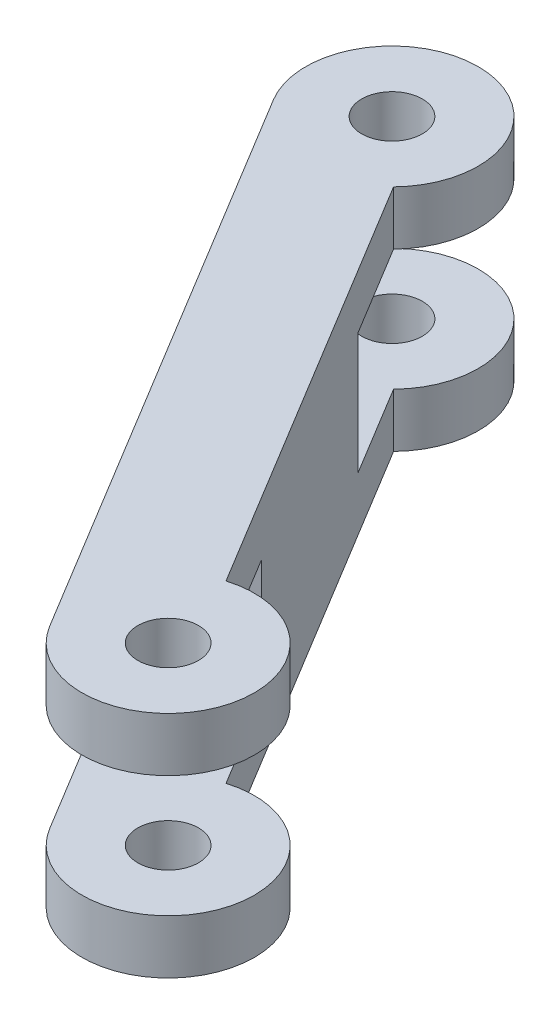
ISO-10303-21;
HEADER;
FILE_DESCRIPTION(('STEP AP214'),'2;1');
FILE_NAME('part.step','',(''),(''),'','','');
FILE_SCHEMA(('AUTOMOTIVE_DESIGN { 1 0 10303 214 1 1 1 1 }'));
ENDSEC;
DATA;
#1=APPLICATION_CONTEXT('core data for automotive mechanical design processes');
#2=APPLICATION_PROTOCOL_DEFINITION('international standard','automotive_design',2000,#1);
#3=PRODUCT_CONTEXT('',#1,'mechanical');
#4=PRODUCT('Part','Part','',(#3));
#5=PRODUCT_RELATED_PRODUCT_CATEGORY('part','',(#4));
#6=PRODUCT_DEFINITION_FORMATION('','',#4);
#7=PRODUCT_DEFINITION_CONTEXT('part definition',#1,'design');
#8=PRODUCT_DEFINITION('design','',#6,#7);
#9=PRODUCT_DEFINITION_SHAPE('','',#8);
#10=(LENGTH_UNIT() NAMED_UNIT(*) SI_UNIT(.MILLI.,.METRE.));
#11=(NAMED_UNIT(*) PLANE_ANGLE_UNIT() SI_UNIT($,.RADIAN.));
#12=(NAMED_UNIT(*) SI_UNIT($,.STERADIAN.) SOLID_ANGLE_UNIT());
#13=UNCERTAINTY_MEASURE_WITH_UNIT(LENGTH_MEASURE(1.E-05),#10,'distance_accuracy_value','');
#14=(GEOMETRIC_REPRESENTATION_CONTEXT(3) GLOBAL_UNCERTAINTY_ASSIGNED_CONTEXT((#13)) GLOBAL_UNIT_ASSIGNED_CONTEXT((#10,
#11,#12)) REPRESENTATION_CONTEXT('',''));
#15=CARTESIAN_POINT('',(0.,0.,0.));
#16=DIRECTION('',(0.,0.,1.));
#17=DIRECTION('',(1.,0.,0.));
#18=AXIS2_PLACEMENT_3D('',#15,#16,#17);
#19=CARTESIAN_POINT('',(-11.5932669396114,8.5,-44.075726171395));
#20=DIRECTION('',(0.,-1.,0.));
#21=DIRECTION('',(0.,0.,-1.));
#22=AXIS2_PLACEMENT_3D('',#19,#20,#21);
#23=CYLINDRICAL_SURFACE('',#22,3.2);
#24=DIRECTION('',(0.,-1.,0.));
#25=VECTOR('',#24,1.);
#26=CARTESIAN_POINT('',(-14.3301111309724,8.5,-42.4175090950708));
#27=LINE('',#26,#25);
#28=CARTESIAN_POINT('',(-14.3301111309724,8.5,-42.4175090950708));
#29=VERTEX_POINT('',#28);
#30=CARTESIAN_POINT('',(-14.3301111309724,6.5,-42.4175090950708));
#31=VERTEX_POINT('',#30);
#32=EDGE_CURVE('E218',#29,#31,#27,.T.);
#33=ORIENTED_EDGE('',*,*,#32,.T.);
#34=CARTESIAN_POINT('',(-11.5932669396114,6.5,-44.075726171395));
#35=DIRECTION('',(0.,1.,0.));
#36=DIRECTION('',(0.,0.,1.));
#37=AXIS2_PLACEMENT_3D('',#34,#35,#36);
#38=CIRCLE('',#37,3.2);
#39=CARTESIAN_POINT('',(-12.5124297836722,6.5,-47.1408753791984));
#40=VERTEX_POINT('',#39);
#41=EDGE_CURVE('E152',#31,#40,#38,.T.);
#42=ORIENTED_EDGE('',*,*,#41,.T.);
#43=DIRECTION('',(0.,-1.,0.));
#44=VECTOR('',#43,1.);
#45=CARTESIAN_POINT('',(-12.5124297836722,8.5,-47.1408753791984));
#46=LINE('',#45,#44);
#47=CARTESIAN_POINT('',(-12.5124297836722,8.5,-47.1408753791984));
#48=VERTEX_POINT('',#47);
#49=EDGE_CURVE('E215',#48,#40,#46,.T.);
#50=ORIENTED_EDGE('',*,*,#49,.F.);
#51=CARTESIAN_POINT('',(-11.5932669396114,8.5,-44.075726171395));
#52=DIRECTION('',(0.,1.,0.));
#53=DIRECTION('',(0.,0.,1.));
#54=AXIS2_PLACEMENT_3D('',#51,#52,#53);
#55=CIRCLE('',#54,3.2);
#56=EDGE_CURVE('E197',#29,#48,#55,.T.);
#57=ORIENTED_EDGE('',*,*,#56,.F.);
#58=EDGE_LOOP('',(#33,#42,#50,#57));
#59=FACE_BOUND('',#58,.T.);
#60=ADVANCED_FACE('F32',(#59),#23,.T.);
#61=CARTESIAN_POINT('',(-11.5932669396114,8.5,-44.075726171395));
#62=DIRECTION('',(0.,-1.,0.));
#63=DIRECTION('',(0.,0.,-1.));
#64=AXIS2_PLACEMENT_3D('',#61,#62,#63);
#65=CYLINDRICAL_SURFACE('',#64,1.125);
#66=CARTESIAN_POINT('',(-11.5932669396114,6.5,-44.075726171395));
#67=DIRECTION('',(0.,1.,0.));
#68=DIRECTION('',(0.,0.,1.));
#69=AXIS2_PLACEMENT_3D('',#66,#67,#68);
#70=CIRCLE('',#69,1.125);
#71=CARTESIAN_POINT('',(-11.5932669396114,6.5,-42.950726171395));
#72=VERTEX_POINT('',#71);
#73=EDGE_CURVE('E148',#72,#72,#70,.T.);
#74=ORIENTED_EDGE('',*,*,#73,.F.);
#75=EDGE_LOOP('',(#74));
#76=FACE_BOUND('',#75,.T.);
#77=CARTESIAN_POINT('',(-11.5932669396114,8.5,-44.075726171395));
#78=DIRECTION('',(0.,1.,0.));
#79=DIRECTION('',(0.,0.,1.));
#80=AXIS2_PLACEMENT_3D('',#77,#78,#79);
#81=CIRCLE('',#80,1.125);
#82=CARTESIAN_POINT('',(-11.5932669396114,8.5,-42.950726171395));
#83=VERTEX_POINT('',#82);
#84=EDGE_CURVE('E179',#83,#83,#81,.T.);
#85=ORIENTED_EDGE('',*,*,#84,.T.);
#86=EDGE_LOOP('',(#85));
#87=FACE_BOUND('',#86,.T.);
#88=ADVANCED_FACE('F238',(#76,#87),#65,.F.);
#89=CARTESIAN_POINT('',(-24.3568181025923,8.5,-65.1416356716025));
#90=DIRECTION('',(0.,-1.,0.));
#91=DIRECTION('',(0.,0.,-1.));
#92=AXIS2_PLACEMENT_3D('',#89,#90,#91);
#93=CYLINDRICAL_SURFACE('',#92,3.19999999999999);
#94=DIRECTION('',(0.,-1.,0.));
#95=VECTOR('',#94,1.);
#96=CARTESIAN_POINT('',(-27.0936622939533,8.5,-63.4834185952783));
#97=LINE('',#96,#95);
#98=CARTESIAN_POINT('',(-27.0936622939533,2.,-63.4834185952783));
#99=VERTEX_POINT('',#98);
#100=CARTESIAN_POINT('',(-27.0936622939533,0.,-63.4834185952783));
#101=VERTEX_POINT('',#100);
#102=EDGE_CURVE('E221',#99,#101,#97,.T.);
#103=ORIENTED_EDGE('',*,*,#102,.F.);
#104=CARTESIAN_POINT('',(-24.3568181025923,2.,-65.1416356716025));
#105=DIRECTION('',(0.,-1.,0.));
#106=DIRECTION('',(0.,0.,-1.));
#107=AXIS2_PLACEMENT_3D('',#104,#105,#106);
#108=CIRCLE('',#107,3.19999999999999);
#109=CARTESIAN_POINT('',(-22.0654500812946,2.,-62.9078871201817));
#110=VERTEX_POINT('',#109);
#111=EDGE_CURVE('E175',#99,#110,#108,.T.);
#112=ORIENTED_EDGE('',*,*,#111,.T.);
#113=DIRECTION('',(0.,-1.,0.));
#114=VECTOR('',#113,1.);
#115=CARTESIAN_POINT('',(-22.0654500812946,8.5,-62.9078871201817));
#116=LINE('',#115,#114);
#117=CARTESIAN_POINT('',(-22.0654500812946,0.,-62.9078871201817));
#118=VERTEX_POINT('',#117);
#119=EDGE_CURVE('E201',#110,#118,#116,.T.);
#120=ORIENTED_EDGE('',*,*,#119,.T.);
#121=CARTESIAN_POINT('',(-24.3568181025923,0.,-65.1416356716025));
#122=DIRECTION('',(0.,1.,0.));
#123=DIRECTION('',(0.,0.,1.));
#124=AXIS2_PLACEMENT_3D('',#121,#122,#123);
#125=CIRCLE('',#124,3.19999999999999);
#126=EDGE_CURVE('E188',#118,#101,#125,.T.);
#127=ORIENTED_EDGE('',*,*,#126,.T.);
#128=EDGE_LOOP('',(#103,#112,#120,#127));
#129=FACE_BOUND('',#128,.T.);
#130=ADVANCED_FACE('F241',(#129),#93,.T.);
#131=CARTESIAN_POINT('',(-24.3568181025923,8.5,-65.1416356716025));
#132=DIRECTION('',(0.,-1.,0.));
#133=DIRECTION('',(0.,0.,-1.));
#134=AXIS2_PLACEMENT_3D('',#131,#132,#133);
#135=CYLINDRICAL_SURFACE('',#134,1.125);
#136=CARTESIAN_POINT('',(-24.3568181025923,2.,-65.1416356716025));
#137=DIRECTION('',(0.,-1.,0.));
#138=DIRECTION('',(0.,0.,-1.));
#139=AXIS2_PLACEMENT_3D('',#136,#137,#138);
#140=CIRCLE('',#139,1.125);
#141=CARTESIAN_POINT('',(-24.3568181025923,2.,-66.2666356716025));
#142=VERTEX_POINT('',#141);
#143=EDGE_CURVE('E171',#142,#142,#140,.T.);
#144=ORIENTED_EDGE('',*,*,#143,.F.);
#145=EDGE_LOOP('',(#144));
#146=FACE_BOUND('',#145,.T.);
#147=CARTESIAN_POINT('',(-24.3568181025923,0.,-65.1416356716025));
#148=DIRECTION('',(0.,1.,0.));
#149=DIRECTION('',(0.,0.,1.));
#150=AXIS2_PLACEMENT_3D('',#147,#148,#149);
#151=CIRCLE('',#150,1.125);
#152=CARTESIAN_POINT('',(-24.3568181025923,0.,-64.0166356716025));
#153=VERTEX_POINT('',#152);
#154=EDGE_CURVE('E182',#153,#153,#151,.T.);
#155=ORIENTED_EDGE('',*,*,#154,.F.);
#156=EDGE_LOOP('',(#155));
#157=FACE_BOUND('',#156,.T.);
#158=ADVANCED_FACE('F249',(#146,#157),#135,.F.);
#159=CARTESIAN_POINT('',(-24.3568181025923,8.5,-65.1416356716025));
#160=DIRECTION('',(0.,1.,0.));
#161=DIRECTION('',(0.,0.,1.));
#162=AXIS2_PLACEMENT_3D('',#159,#160,#161);
#163=PLANE('',#162);
#164=CARTESIAN_POINT('',(-24.3568181025923,8.5,-65.1416356716025));
#165=DIRECTION('',(0.,1.,0.));
#166=DIRECTION('',(0.,0.,1.));
#167=AXIS2_PLACEMENT_3D('',#164,#165,#166);
#168=CIRCLE('',#167,1.125);
#169=CARTESIAN_POINT('',(-24.3568181025923,8.5,-64.0166356716025));
#170=VERTEX_POINT('',#169);
#171=EDGE_CURVE('E185',#170,#170,#168,.T.);
#172=ORIENTED_EDGE('',*,*,#171,.F.);
#173=EDGE_LOOP('',(#172));
#174=FACE_BOUND('',#173,.T.);
#175=CARTESIAN_POINT('',(-24.3568181025923,8.5,-65.1416356716025));
#176=DIRECTION('',(0.,1.,0.));
#177=DIRECTION('',(0.,0.,1.));
#178=AXIS2_PLACEMENT_3D('',#175,#176,#177);
#179=CIRCLE('',#178,3.19999999999999);
#180=CARTESIAN_POINT('',(-22.0654500812946,8.5,-62.9078871201817));
#181=VERTEX_POINT('',#180);
#182=CARTESIAN_POINT('',(-27.0936622939533,8.5,-63.4834185952783));
#183=VERTEX_POINT('',#182);
#184=EDGE_CURVE('E191',#181,#183,#179,.T.);
#185=ORIENTED_EDGE('',*,*,#184,.T.);
#186=DIRECTION('',(0.518192836351311,0.,0.855263809800335));
#187=VECTOR('',#186,1.);
#188=CARTESIAN_POINT('',(-27.0936622939533,8.5,-63.4834185952783));
#189=LINE('',#188,#187);
#190=EDGE_CURVE('E194',#183,#29,#189,.T.);
#191=ORIENTED_EDGE('',*,*,#190,.T.);
#192=ORIENTED_EDGE('',*,*,#56,.T.);
#193=DIRECTION('',(-0.518192836351311,0.,-0.855263809800335));
#194=VECTOR('',#193,1.);
#195=CARTESIAN_POINT('',(-22.0654500812946,8.5,-62.9078871201817));
#196=LINE('',#195,#194);
#197=EDGE_CURVE('E199',#48,#181,#196,.T.);
#198=ORIENTED_EDGE('',*,*,#197,.T.);
#199=EDGE_LOOP('',(#185,#191,#192,#198));
#200=FACE_BOUND('',#199,.T.);
#201=ORIENTED_EDGE('',*,*,#84,.F.);
#202=EDGE_LOOP('',(#201));
#203=FACE_BOUND('',#202,.T.);
#204=ADVANCED_FACE('F246',(#174,#200,#203),#163,.T.);
#205=CARTESIAN_POINT('',(-24.3568181025923,0.,-65.1416356716025));
#206=DIRECTION('',(0.,1.,0.));
#207=DIRECTION('',(0.,0.,1.));
#208=AXIS2_PLACEMENT_3D('',#205,#206,#207);
#209=PLANE('',#208);
#210=ORIENTED_EDGE('',*,*,#126,.F.);
#211=DIRECTION('',(-0.518192836351311,0.,-0.855263809800335));
#212=VECTOR('',#211,1.);
#213=CARTESIAN_POINT('',(-22.0654500812946,0.,-62.9078871201817));
#214=LINE('',#213,#212);
#215=CARTESIAN_POINT('',(-12.5124297836722,0.,-47.1408753791984));
#216=VERTEX_POINT('',#215);
#217=EDGE_CURVE('E195',#216,#118,#214,.T.);
#218=ORIENTED_EDGE('',*,*,#217,.F.);
#219=CARTESIAN_POINT('',(-11.5932669396114,0.,-44.075726171395));
#220=DIRECTION('',(0.,1.,0.));
#221=DIRECTION('',(0.,0.,1.));
#222=AXIS2_PLACEMENT_3D('',#219,#220,#221);
#223=CIRCLE('',#222,3.2);
#224=CARTESIAN_POINT('',(-14.3301111309724,0.,-42.4175090950708));
#225=VERTEX_POINT('',#224);
#226=EDGE_CURVE('E206',#225,#216,#223,.T.);
#227=ORIENTED_EDGE('',*,*,#226,.F.);
#228=DIRECTION('',(0.518192836351311,0.,0.855263809800335));
#229=VECTOR('',#228,1.);
#230=CARTESIAN_POINT('',(-27.0936622939533,0.,-63.4834185952783));
#231=LINE('',#230,#229);
#232=EDGE_CURVE('E204',#101,#225,#231,.T.);
#233=ORIENTED_EDGE('',*,*,#232,.F.);
#234=EDGE_LOOP('',(#210,#218,#227,#233));
#235=FACE_BOUND('',#234,.T.);
#236=ORIENTED_EDGE('',*,*,#154,.T.);
#237=EDGE_LOOP('',(#236));
#238=FACE_BOUND('',#237,.T.);
#239=CARTESIAN_POINT('',(-11.5932669396114,0.,-44.075726171395));
#240=DIRECTION('',(0.,1.,0.));
#241=DIRECTION('',(0.,0.,1.));
#242=AXIS2_PLACEMENT_3D('',#239,#240,#241);
#243=CIRCLE('',#242,1.125);
#244=CARTESIAN_POINT('',(-11.5932669396114,0.,-42.950726171395));
#245=VERTEX_POINT('',#244);
#246=EDGE_CURVE('E178',#245,#245,#243,.T.);
#247=ORIENTED_EDGE('',*,*,#246,.T.);
#248=EDGE_LOOP('',(#247));
#249=FACE_BOUND('',#248,.T.);
#250=ADVANCED_FACE('F248',(#235,#238,#249),#209,.F.);
#251=CARTESIAN_POINT('',(-22.0654500812946,6.5,-62.9078871201817));
#252=VERTEX_POINT('',#251);
#253=EDGE_CURVE('E211',#181,#252,#116,.T.);
#254=ORIENTED_EDGE('',*,*,#253,.T.);
#255=CARTESIAN_POINT('',(-24.3568181025923,6.5,-65.1416356716025));
#256=DIRECTION('',(0.,1.,0.));
#257=DIRECTION('',(0.,0.,1.));
#258=AXIS2_PLACEMENT_3D('',#255,#256,#257);
#259=CIRCLE('',#258,3.19999999999999);
#260=CARTESIAN_POINT('',(-27.0936622939533,6.5,-63.4834185952783));
#261=VERTEX_POINT('',#260);
#262=EDGE_CURVE('E55',#252,#261,#259,.T.);
#263=ORIENTED_EDGE('',*,*,#262,.T.);
#264=EDGE_CURVE('E222',#183,#261,#97,.T.);
#265=ORIENTED_EDGE('',*,*,#264,.F.);
#266=ORIENTED_EDGE('',*,*,#184,.F.);
#267=EDGE_LOOP('',(#254,#263,#265,#266));
#268=FACE_BOUND('',#267,.T.);
#269=ADVANCED_FACE('F34',(#268),#93,.T.);
#270=CARTESIAN_POINT('',(-27.0936622939533,8.5,-63.4834185952783));
#271=DIRECTION('',(0.855263809800335,0.,-0.518192836351311));
#272=DIRECTION('',(-0.518192836351311,0.,-0.855263809800335));
#273=AXIS2_PLACEMENT_3D('',#270,#271,#272);
#274=PLANE('',#273);
#275=DIRECTION('',(0.,-1.,0.));
#276=VECTOR('',#275,1.);
#277=CARTESIAN_POINT('',(-17.9574609854316,2.,-48.4043557636731));
#278=LINE('',#277,#276);
#279=CARTESIAN_POINT('',(-17.9574609854316,6.5,-48.4043557636731));
#280=VERTEX_POINT('',#279);
#281=CARTESIAN_POINT('',(-17.9574609854316,2.,-48.4043557636731));
#282=VERTEX_POINT('',#281);
#283=EDGE_CURVE('E130',#280,#282,#278,.T.);
#284=ORIENTED_EDGE('',*,*,#283,.F.);
#285=DIRECTION('',(-0.518192836351311,0.,-0.855263809800335));
#286=VECTOR('',#285,1.);
#287=CARTESIAN_POINT('',(-17.9574609854316,6.5,-48.4043557636731));
#288=LINE('',#287,#286);
#289=EDGE_CURVE('E127',#31,#280,#288,.T.);
#290=ORIENTED_EDGE('',*,*,#289,.F.);
#291=ORIENTED_EDGE('',*,*,#32,.F.);
#292=ORIENTED_EDGE('',*,*,#190,.F.);
#293=ORIENTED_EDGE('',*,*,#264,.T.);
#294=DIRECTION('',(-0.518192836351311,0.,-0.855263809800335));
#295=VECTOR('',#294,1.);
#296=CARTESIAN_POINT('',(-23.4663124394942,6.5,-57.4965719266759));
#297=LINE('',#296,#295);
#298=CARTESIAN_POINT('',(-23.4663124394942,6.5,-57.4965719266759));
#299=VERTEX_POINT('',#298);
#300=EDGE_CURVE('E158',#299,#261,#297,.T.);
#301=ORIENTED_EDGE('',*,*,#300,.F.);
#302=DIRECTION('',(0.,1.,0.));
#303=VECTOR('',#302,1.);
#304=CARTESIAN_POINT('',(-23.4663124394942,6.5,-57.4965719266759));
#305=LINE('',#304,#303);
#306=CARTESIAN_POINT('',(-23.4663124394942,2.,-57.4965719266759));
#307=VERTEX_POINT('',#306);
#308=EDGE_CURVE('E155',#307,#299,#305,.T.);
#309=ORIENTED_EDGE('',*,*,#308,.F.);
#310=DIRECTION('',(0.518192836351311,0.,0.855263809800335));
#311=VECTOR('',#310,1.);
#312=CARTESIAN_POINT('',(-23.4663124394942,2.,-57.4965719266759));
#313=LINE('',#312,#311);
#314=EDGE_CURVE('E160',#99,#307,#313,.T.);
#315=ORIENTED_EDGE('',*,*,#314,.F.);
#316=ORIENTED_EDGE('',*,*,#102,.T.);
#317=ORIENTED_EDGE('',*,*,#232,.T.);
#318=CARTESIAN_POINT('',(-14.3301111309724,2.,-42.4175090950708));
#319=VERTEX_POINT('',#318);
#320=EDGE_CURVE('E140',#319,#225,#27,.T.);
#321=ORIENTED_EDGE('',*,*,#320,.F.);
#322=DIRECTION('',(0.518192836351311,0.,0.855263809800335));
#323=VECTOR('',#322,1.);
#324=CARTESIAN_POINT('',(-17.9574609854316,2.,-48.4043557636731));
#325=LINE('',#324,#323);
#326=EDGE_CURVE('E123',#282,#319,#325,.T.);
#327=ORIENTED_EDGE('',*,*,#326,.F.);
#328=EDGE_LOOP('',(#284,#290,#291,#292,#293,#301,#309,#315,#316,#317,#321,#327));
#329=FACE_BOUND('',#328,.T.);
#330=ADVANCED_FACE('F138',(#329),#274,.F.);
#331=CARTESIAN_POINT('',(-12.5124297836722,2.,-47.1408753791984));
#332=VERTEX_POINT('',#331);
#333=EDGE_CURVE('E214',#332,#216,#46,.T.);
#334=ORIENTED_EDGE('',*,*,#333,.F.);
#335=CARTESIAN_POINT('',(-11.5932669396114,2.,-44.075726171395));
#336=DIRECTION('',(0.,-1.,0.));
#337=DIRECTION('',(0.,0.,-1.));
#338=AXIS2_PLACEMENT_3D('',#335,#336,#337);
#339=CIRCLE('',#338,3.2);
#340=EDGE_CURVE('E47',#332,#319,#339,.T.);
#341=ORIENTED_EDGE('',*,*,#340,.T.);
#342=ORIENTED_EDGE('',*,*,#320,.T.);
#343=ORIENTED_EDGE('',*,*,#226,.T.);
#344=EDGE_LOOP('',(#334,#341,#342,#343));
#345=FACE_BOUND('',#344,.T.);
#346=ADVANCED_FACE('F266',(#345),#23,.T.);
#347=CARTESIAN_POINT('',(-22.0654500812946,8.5,-62.9078871201817));
#348=DIRECTION('',(-0.855263809800335,0.,0.518192836351311));
#349=DIRECTION('',(0.518192836351311,0.,0.855263809800335));
#350=AXIS2_PLACEMENT_3D('',#347,#348,#349);
#351=PLANE('',#350);
#352=ORIENTED_EDGE('',*,*,#49,.T.);
#353=DIRECTION('',(-0.518192836351311,0.,-0.855263809800335));
#354=VECTOR('',#353,1.);
#355=CARTESIAN_POINT('',(-22.0654500812946,6.5,-62.9078871201817));
#356=LINE('',#355,#354);
#357=CARTESIAN_POINT('',(-14.5345142054521,6.5,-50.4782731681887));
#358=VERTEX_POINT('',#357);
#359=EDGE_CURVE('E149',#40,#358,#356,.T.);
#360=ORIENTED_EDGE('',*,*,#359,.T.);
#361=DIRECTION('',(0.,-1.,0.));
#362=VECTOR('',#361,1.);
#363=CARTESIAN_POINT('',(-14.5345142054521,8.5,-50.4782731681886));
#364=LINE('',#363,#362);
#365=CARTESIAN_POINT('',(-14.5345142054521,2.,-50.4782731681887));
#366=VERTEX_POINT('',#365);
#367=EDGE_CURVE('E11',#358,#366,#364,.T.);
#368=ORIENTED_EDGE('',*,*,#367,.T.);
#369=DIRECTION('',(0.518192836351311,0.,0.855263809800335));
#370=VECTOR('',#369,1.);
#371=CARTESIAN_POINT('',(-22.0654500812946,2.,-62.9078871201817));
#372=LINE('',#371,#370);
#373=EDGE_CURVE('E124',#366,#332,#372,.T.);
#374=ORIENTED_EDGE('',*,*,#373,.T.);
#375=ORIENTED_EDGE('',*,*,#333,.T.);
#376=ORIENTED_EDGE('',*,*,#217,.T.);
#377=ORIENTED_EDGE('',*,*,#119,.F.);
#378=DIRECTION('',(0.518192836351311,0.,0.855263809800335));
#379=VECTOR('',#378,1.);
#380=CARTESIAN_POINT('',(-22.0654500812946,2.,-62.9078871201817));
#381=LINE('',#380,#379);
#382=CARTESIAN_POINT('',(-20.0433656595147,2.,-59.5704893311914));
#383=VERTEX_POINT('',#382);
#384=EDGE_CURVE('E172',#110,#383,#381,.T.);
#385=ORIENTED_EDGE('',*,*,#384,.T.);
#386=DIRECTION('',(0.,1.,0.));
#387=VECTOR('',#386,1.);
#388=CARTESIAN_POINT('',(-20.0433656595147,8.5,-59.5704893311914));
#389=LINE('',#388,#387);
#390=CARTESIAN_POINT('',(-20.0433656595147,6.5,-59.5704893311914));
#391=VERTEX_POINT('',#390);
#392=EDGE_CURVE('E40',#383,#391,#389,.T.);
#393=ORIENTED_EDGE('',*,*,#392,.T.);
#394=DIRECTION('',(-0.518192836351311,0.,-0.855263809800335));
#395=VECTOR('',#394,1.);
#396=CARTESIAN_POINT('',(-22.0654500812946,6.5,-62.9078871201817));
#397=LINE('',#396,#395);
#398=EDGE_CURVE('E168',#391,#252,#397,.T.);
#399=ORIENTED_EDGE('',*,*,#398,.T.);
#400=ORIENTED_EDGE('',*,*,#253,.F.);
#401=ORIENTED_EDGE('',*,*,#197,.F.);
#402=EDGE_LOOP('',(#352,#360,#368,#374,#375,#376,#377,#385,#393,#399,#400,#401));
#403=FACE_BOUND('',#402,.T.);
#404=ADVANCED_FACE('F271',(#403),#351,.F.);
#405=CARTESIAN_POINT('',(-24.3568181025923,6.5,-65.1416356716025));
#406=DIRECTION('',(0.,1.,0.));
#407=DIRECTION('',(0.,0.,1.));
#408=AXIS2_PLACEMENT_3D('',#405,#406,#407);
#409=CIRCLE('',#408,1.125);
#410=CARTESIAN_POINT('',(-24.3568181025923,6.5,-64.0166356716025));
#411=VERTEX_POINT('',#410);
#412=EDGE_CURVE('E166',#411,#411,#409,.T.);
#413=ORIENTED_EDGE('',*,*,#412,.F.);
#414=EDGE_LOOP('',(#413));
#415=FACE_BOUND('',#414,.T.);
#416=ORIENTED_EDGE('',*,*,#171,.T.);
#417=EDGE_LOOP('',(#416));
#418=FACE_BOUND('',#417,.T.);
#419=ADVANCED_FACE('F260',(#415,#418),#135,.F.);
#420=CARTESIAN_POINT('',(-11.5932669396114,2.,-44.075726171395));
#421=DIRECTION('',(0.,-1.,0.));
#422=DIRECTION('',(0.,0.,-1.));
#423=AXIS2_PLACEMENT_3D('',#420,#421,#422);
#424=CIRCLE('',#423,1.125);
#425=CARTESIAN_POINT('',(-11.5932669396114,2.,-45.200726171395));
#426=VERTEX_POINT('',#425);
#427=EDGE_CURVE('E144',#426,#426,#424,.T.);
#428=ORIENTED_EDGE('',*,*,#427,.F.);
#429=EDGE_LOOP('',(#428));
#430=FACE_BOUND('',#429,.T.);
#431=ORIENTED_EDGE('',*,*,#246,.F.);
#432=EDGE_LOOP('',(#431));
#433=FACE_BOUND('',#432,.T.);
#434=ADVANCED_FACE('F243',(#430,#433),#65,.F.);
#435=CARTESIAN_POINT('',(-16.1965700561913,6.5,-61.9012110356621));
#436=DIRECTION('',(0.518192836351311,0.,0.855263809800335));
#437=DIRECTION('',(0.855263809800335,0.,-0.518192836351311));
#438=AXIS2_PLACEMENT_3D('',#435,#436,#437);
#439=PLANE('',#438);
#440=DIRECTION('',(-0.855263809800335,0.,0.518192836351311));
#441=VECTOR('',#440,1.);
#442=CARTESIAN_POINT('',(-16.1965700561913,2.,-61.9012110356621));
#443=LINE('',#442,#441);
#444=EDGE_CURVE('E164',#383,#307,#443,.T.);
#445=ORIENTED_EDGE('',*,*,#444,.T.);
#446=ORIENTED_EDGE('',*,*,#308,.T.);
#447=DIRECTION('',(-0.855263809800335,0.,0.518192836351311));
#448=VECTOR('',#447,1.);
#449=CARTESIAN_POINT('',(-16.1965700561913,6.5,-61.9012110356621));
#450=LINE('',#449,#448);
#451=EDGE_CURVE('E163',#391,#299,#450,.T.);
#452=ORIENTED_EDGE('',*,*,#451,.F.);
#453=ORIENTED_EDGE('',*,*,#392,.F.);
#454=EDGE_LOOP('',(#445,#446,#452,#453));
#455=FACE_BOUND('',#454,.T.);
#456=ADVANCED_FACE('F296',(#455),#439,.F.);
#457=CARTESIAN_POINT('',(-16.1965700561913,2.,-61.9012110356621));
#458=DIRECTION('',(0.,-1.,0.));
#459=DIRECTION('',(0.,0.,-1.));
#460=AXIS2_PLACEMENT_3D('',#457,#458,#459);
#461=PLANE('',#460);
#462=ORIENTED_EDGE('',*,*,#143,.T.);
#463=EDGE_LOOP('',(#462));
#464=FACE_BOUND('',#463,.T.);
#465=ORIENTED_EDGE('',*,*,#314,.T.);
#466=ORIENTED_EDGE('',*,*,#444,.F.);
#467=ORIENTED_EDGE('',*,*,#384,.F.);
#468=ORIENTED_EDGE('',*,*,#111,.F.);
#469=EDGE_LOOP('',(#465,#466,#467,#468));
#470=FACE_BOUND('',#469,.T.);
#471=ADVANCED_FACE('F314',(#464,#470),#461,.F.);
#472=CARTESIAN_POINT('',(-16.1965700561913,6.5,-61.9012110356621));
#473=DIRECTION('',(0.,1.,0.));
#474=DIRECTION('',(0.,0.,1.));
#475=AXIS2_PLACEMENT_3D('',#472,#473,#474);
#476=PLANE('',#475);
#477=ORIENTED_EDGE('',*,*,#412,.T.);
#478=EDGE_LOOP('',(#477));
#479=FACE_BOUND('',#478,.T.);
#480=ORIENTED_EDGE('',*,*,#398,.F.);
#481=ORIENTED_EDGE('',*,*,#451,.T.);
#482=ORIENTED_EDGE('',*,*,#300,.T.);
#483=ORIENTED_EDGE('',*,*,#262,.F.);
#484=EDGE_LOOP('',(#480,#481,#482,#483));
#485=FACE_BOUND('',#484,.T.);
#486=ADVANCED_FACE('F294',(#479,#485),#476,.F.);
#487=CARTESIAN_POINT('',(-10.6877186021288,2.,-52.8089948726593));
#488=DIRECTION('',(-0.518192836351311,0.,-0.855263809800335));
#489=DIRECTION('',(-0.855263809800335,0.,0.518192836351311));
#490=AXIS2_PLACEMENT_3D('',#487,#488,#489);
#491=PLANE('',#490);
#492=DIRECTION('',(-0.855263809800335,0.,0.518192836351311));
#493=VECTOR('',#492,1.);
#494=CARTESIAN_POINT('',(-10.6877186021288,6.5,-52.8089948726593));
#495=LINE('',#494,#493);
#496=EDGE_CURVE('E126',#358,#280,#495,.T.);
#497=ORIENTED_EDGE('',*,*,#496,.T.);
#498=ORIENTED_EDGE('',*,*,#283,.T.);
#499=DIRECTION('',(-0.855263809800335,0.,0.518192836351311));
#500=VECTOR('',#499,1.);
#501=CARTESIAN_POINT('',(-10.6877186021288,2.,-52.8089948726593));
#502=LINE('',#501,#500);
#503=EDGE_CURVE('E119',#366,#282,#502,.T.);
#504=ORIENTED_EDGE('',*,*,#503,.F.);
#505=ORIENTED_EDGE('',*,*,#367,.F.);
#506=EDGE_LOOP('',(#497,#498,#504,#505));
#507=FACE_BOUND('',#506,.T.);
#508=ADVANCED_FACE('F131',(#507),#491,.F.);
#509=CARTESIAN_POINT('',(-10.6877186021288,6.5,-52.8089948726593));
#510=DIRECTION('',(0.,1.,0.));
#511=DIRECTION('',(0.,0.,1.));
#512=AXIS2_PLACEMENT_3D('',#509,#510,#511);
#513=PLANE('',#512);
#514=ORIENTED_EDGE('',*,*,#73,.T.);
#515=EDGE_LOOP('',(#514));
#516=FACE_BOUND('',#515,.T.);
#517=ORIENTED_EDGE('',*,*,#289,.T.);
#518=ORIENTED_EDGE('',*,*,#496,.F.);
#519=ORIENTED_EDGE('',*,*,#359,.F.);
#520=ORIENTED_EDGE('',*,*,#41,.F.);
#521=EDGE_LOOP('',(#517,#518,#519,#520));
#522=FACE_BOUND('',#521,.T.);
#523=ADVANCED_FACE('F235',(#516,#522),#513,.F.);
#524=CARTESIAN_POINT('',(-10.6877186021288,2.,-52.8089948726593));
#525=DIRECTION('',(0.,-1.,0.));
#526=DIRECTION('',(0.,0.,-1.));
#527=AXIS2_PLACEMENT_3D('',#524,#525,#526);
#528=PLANE('',#527);
#529=ORIENTED_EDGE('',*,*,#427,.T.);
#530=EDGE_LOOP('',(#529));
#531=FACE_BOUND('',#530,.T.);
#532=ORIENTED_EDGE('',*,*,#373,.F.);
#533=ORIENTED_EDGE('',*,*,#503,.T.);
#534=ORIENTED_EDGE('',*,*,#326,.T.);
#535=ORIENTED_EDGE('',*,*,#340,.F.);
#536=EDGE_LOOP('',(#532,#533,#534,#535));
#537=FACE_BOUND('',#536,.T.);
#538=ADVANCED_FACE('F121',(#531,#537),#528,.F.);
#539=CLOSED_SHELL('',(#60,#88,#130,#158,#204,#250,#269,#330,#346,#404,#419,#434,#456,#471,#486,
#508,#523,#538));
#540=MANIFOLD_SOLID_BREP('B2',#539);
#541=ADVANCED_BREP_SHAPE_REPRESENTATION('',(#18,#540),#14);
#542=SHAPE_DEFINITION_REPRESENTATION(#9,#541);
ENDSEC;
END-ISO-10303-21;
